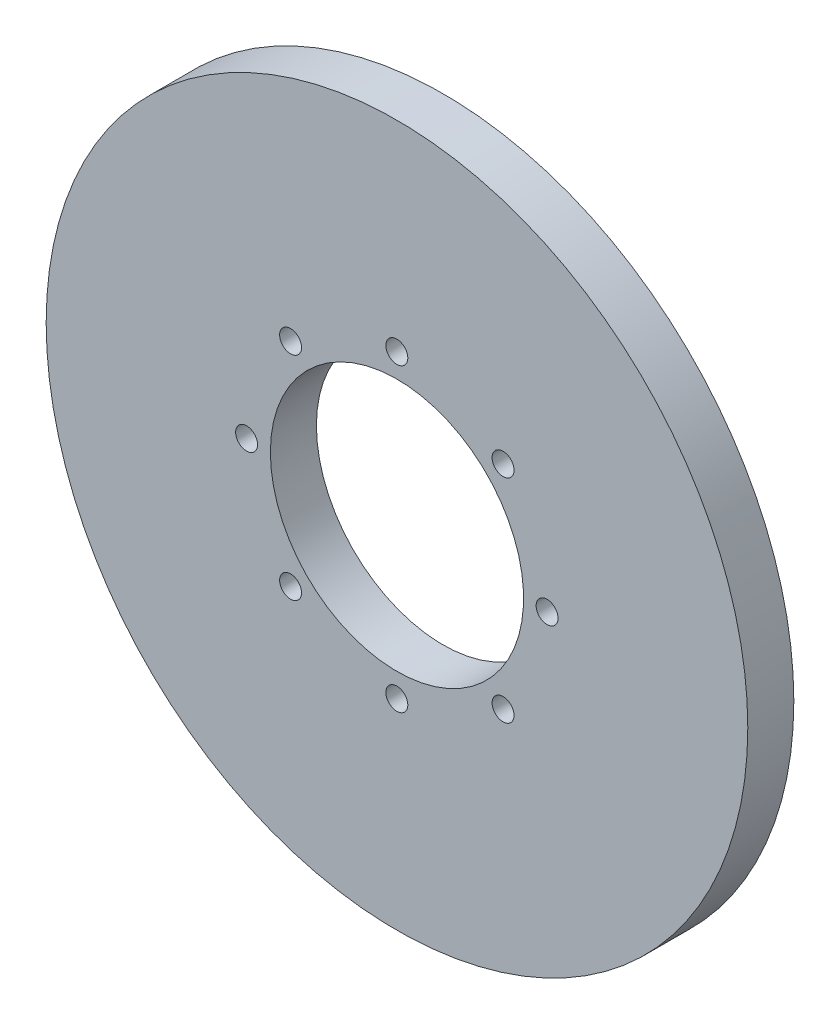
ISO-10303-21;
HEADER;
FILE_DESCRIPTION(('STEP AP214'),'2;1');
FILE_NAME('part.step','',(''),(''),'','','');
FILE_SCHEMA(('AUTOMOTIVE_DESIGN { 1 0 10303 214 1 1 1 1 }'));
ENDSEC;
DATA;
#1=APPLICATION_CONTEXT('core data for automotive mechanical design processes');
#2=APPLICATION_PROTOCOL_DEFINITION('international standard','automotive_design',2000,#1);
#3=PRODUCT_CONTEXT('',#1,'mechanical');
#4=PRODUCT('Part','Part','',(#3));
#5=PRODUCT_RELATED_PRODUCT_CATEGORY('part','',(#4));
#6=PRODUCT_DEFINITION_FORMATION('','',#4);
#7=PRODUCT_DEFINITION_CONTEXT('part definition',#1,'design');
#8=PRODUCT_DEFINITION('design','',#6,#7);
#9=PRODUCT_DEFINITION_SHAPE('','',#8);
#10=(LENGTH_UNIT() NAMED_UNIT(*) SI_UNIT(.MILLI.,.METRE.));
#11=(NAMED_UNIT(*) PLANE_ANGLE_UNIT() SI_UNIT($,.RADIAN.));
#12=(NAMED_UNIT(*) SI_UNIT($,.STERADIAN.) SOLID_ANGLE_UNIT());
#13=UNCERTAINTY_MEASURE_WITH_UNIT(LENGTH_MEASURE(1.E-05),#10,'distance_accuracy_value','');
#14=(GEOMETRIC_REPRESENTATION_CONTEXT(3) GLOBAL_UNCERTAINTY_ASSIGNED_CONTEXT((#13)) GLOBAL_UNIT_ASSIGNED_CONTEXT((#10,
#11,#12)) REPRESENTATION_CONTEXT('',''));
#15=CARTESIAN_POINT('',(0.,0.,0.));
#16=DIRECTION('',(0.,0.,1.));
#17=DIRECTION('',(1.,0.,0.));
#18=AXIS2_PLACEMENT_3D('',#15,#16,#17);
#19=CARTESIAN_POINT('',(0.,0.,20.));
#20=DIRECTION('',(0.,0.,-1.));
#21=DIRECTION('',(-1.,0.,0.));
#22=AXIS2_PLACEMENT_3D('',#19,#20,#21);
#23=CYLINDRICAL_SURFACE('',#22,152.4);
#24=CARTESIAN_POINT('',(0.,0.,20.));
#25=DIRECTION('',(0.,0.,1.));
#26=DIRECTION('',(1.,0.,0.));
#27=AXIS2_PLACEMENT_3D('',#24,#25,#26);
#28=CIRCLE('',#27,152.4);
#29=CARTESIAN_POINT('',(152.4,0.,20.));
#30=VERTEX_POINT('',#29);
#31=EDGE_CURVE('E10',#30,#30,#28,.T.);
#32=ORIENTED_EDGE('',*,*,#31,.F.);
#33=EDGE_LOOP('',(#32));
#34=FACE_BOUND('',#33,.T.);
#35=CARTESIAN_POINT('',(0.,0.,0.));
#36=DIRECTION('',(0.,0.,1.));
#37=DIRECTION('',(1.,0.,0.));
#38=AXIS2_PLACEMENT_3D('',#35,#36,#37);
#39=CIRCLE('',#38,152.4);
#40=CARTESIAN_POINT('',(152.4,0.,0.));
#41=VERTEX_POINT('',#40);
#42=EDGE_CURVE('E39',#41,#41,#39,.T.);
#43=ORIENTED_EDGE('',*,*,#42,.T.);
#44=EDGE_LOOP('',(#43));
#45=FACE_BOUND('',#44,.T.);
#46=ADVANCED_FACE('F36',(#34,#45),#23,.T.);
#47=CARTESIAN_POINT('',(0.,0.,20.));
#48=DIRECTION('',(0.,0.,1.));
#49=DIRECTION('',(1.,0.,0.));
#50=AXIS2_PLACEMENT_3D('',#47,#48,#49);
#51=PLANE('',#50);
#52=CARTESIAN_POINT('',(0.,0.,20.));
#53=DIRECTION('',(0.,0.,-1.));
#54=DIRECTION('',(-1.,0.,0.));
#55=AXIS2_PLACEMENT_3D('',#52,#53,#54);
#56=CIRCLE('',#55,55.);
#57=CARTESIAN_POINT('',(-55.,0.,20.));
#58=VERTEX_POINT('',#57);
#59=EDGE_CURVE('E95',#58,#58,#56,.T.);
#60=ORIENTED_EDGE('',*,*,#59,.T.);
#61=EDGE_LOOP('',(#60));
#62=FACE_BOUND('',#61,.T.);
#63=CARTESIAN_POINT('',(46.0846948431713,46.1484289585171,20.));
#64=DIRECTION('',(0.,0.,-1.));
#65=DIRECTION('',(-1.,0.,0.));
#66=AXIS2_PLACEMENT_3D('',#63,#64,#65);
#67=CIRCLE('',#66,4.7625);
#68=CARTESIAN_POINT('',(41.3221948431713,46.1484289585171,20.));
#69=VERTEX_POINT('',#68);
#70=EDGE_CURVE('E89',#69,#69,#67,.T.);
#71=ORIENTED_EDGE('',*,*,#70,.T.);
#72=EDGE_LOOP('',(#71));
#73=FACE_BOUND('',#72,.T.);
#74=CARTESIAN_POINT('',(-0.0637341153463107,65.263734115347,20.));
#75=DIRECTION('',(0.,0.,-1.));
#76=DIRECTION('',(-1.,0.,0.));
#77=AXIS2_PLACEMENT_3D('',#74,#75,#76);
#78=CIRCLE('',#77,4.76249999999999);
#79=CARTESIAN_POINT('',(-4.82623411534631,65.263734115347,20.));
#80=VERTEX_POINT('',#79);
#81=EDGE_CURVE('E83',#80,#80,#78,.T.);
#82=ORIENTED_EDGE('',*,*,#81,.T.);
#83=EDGE_LOOP('',(#82));
#84=FACE_BOUND('',#83,.T.);
#85=CARTESIAN_POINT('',(-46.2121630738643,46.1484289585181,20.));
#86=DIRECTION('',(0.,0.,-1.));
#87=DIRECTION('',(-1.,0.,0.));
#88=AXIS2_PLACEMENT_3D('',#85,#86,#87);
#89=CIRCLE('',#88,4.7625);
#90=CARTESIAN_POINT('',(-50.9746630738643,46.1484289585181,20.));
#91=VERTEX_POINT('',#90);
#92=EDGE_CURVE('E77',#91,#91,#89,.T.);
#93=ORIENTED_EDGE('',*,*,#92,.T.);
#94=EDGE_LOOP('',(#93));
#95=FACE_BOUND('',#94,.T.);
#96=CARTESIAN_POINT('',(-65.327468230694,0.,20.));
#97=DIRECTION('',(0.,0.,-1.));
#98=DIRECTION('',(-1.,0.,0.));
#99=AXIS2_PLACEMENT_3D('',#96,#97,#98);
#100=CIRCLE('',#99,4.7625);
#101=CARTESIAN_POINT('',(-70.089968230694,0.,20.));
#102=VERTEX_POINT('',#101);
#103=EDGE_CURVE('E71',#102,#102,#100,.T.);
#104=ORIENTED_EDGE('',*,*,#103,.T.);
#105=EDGE_LOOP('',(#104));
#106=FACE_BOUND('',#105,.T.);
#107=CARTESIAN_POINT('',(-46.2121630738649,-46.1484289585174,20.));
#108=DIRECTION('',(0.,0.,-1.));
#109=DIRECTION('',(-1.,0.,0.));
#110=AXIS2_PLACEMENT_3D('',#107,#108,#109);
#111=CIRCLE('',#110,4.7625);
#112=CARTESIAN_POINT('',(-50.9746630738649,-46.1484289585174,20.));
#113=VERTEX_POINT('',#112);
#114=EDGE_CURVE('E65',#113,#113,#111,.T.);
#115=ORIENTED_EDGE('',*,*,#114,.T.);
#116=EDGE_LOOP('',(#115));
#117=FACE_BOUND('',#116,.T.);
#118=CARTESIAN_POINT('',(-0.0637341153472222,-65.263734115347,20.));
#119=DIRECTION('',(0.,0.,-1.));
#120=DIRECTION('',(-1.,0.,0.));
#121=AXIS2_PLACEMENT_3D('',#118,#119,#120);
#122=CIRCLE('',#121,4.76249999999999);
#123=CARTESIAN_POINT('',(-4.82623411534722,-65.263734115347,20.));
#124=VERTEX_POINT('',#123);
#125=EDGE_CURVE('E59',#124,#124,#122,.T.);
#126=ORIENTED_EDGE('',*,*,#125,.T.);
#127=EDGE_LOOP('',(#126));
#128=FACE_BOUND('',#127,.T.);
#129=CARTESIAN_POINT('',(46.0846948431706,-46.1484289585178,20.));
#130=DIRECTION('',(0.,0.,-1.));
#131=DIRECTION('',(-1.,0.,0.));
#132=AXIS2_PLACEMENT_3D('',#129,#130,#131);
#133=CIRCLE('',#132,4.7625);
#134=CARTESIAN_POINT('',(41.3221948431706,-46.1484289585178,20.));
#135=VERTEX_POINT('',#134);
#136=EDGE_CURVE('E53',#135,#135,#133,.T.);
#137=ORIENTED_EDGE('',*,*,#136,.T.);
#138=EDGE_LOOP('',(#137));
#139=FACE_BOUND('',#138,.T.);
#140=CARTESIAN_POINT('',(65.2,0.,20.));
#141=DIRECTION('',(0.,0.,-1.));
#142=DIRECTION('',(-1.,0.,0.));
#143=AXIS2_PLACEMENT_3D('',#140,#141,#142);
#144=CIRCLE('',#143,4.76249999999999);
#145=CARTESIAN_POINT('',(60.4375,0.,20.));
#146=VERTEX_POINT('',#145);
#147=EDGE_CURVE('E46',#146,#146,#144,.T.);
#148=ORIENTED_EDGE('',*,*,#147,.T.);
#149=EDGE_LOOP('',(#148));
#150=FACE_BOUND('',#149,.T.);
#151=ORIENTED_EDGE('',*,*,#31,.T.);
#152=EDGE_LOOP('',(#151));
#153=FACE_BOUND('',#152,.T.);
#154=ADVANCED_FACE('F102',(#62,#73,#84,#95,#106,#117,#128,#139,#150,#153),#51,.T.);
#155=CARTESIAN_POINT('',(0.,0.,0.));
#156=DIRECTION('',(0.,0.,1.));
#157=DIRECTION('',(1.,0.,0.));
#158=AXIS2_PLACEMENT_3D('',#155,#156,#157);
#159=PLANE('',#158);
#160=CARTESIAN_POINT('',(0.,0.,0.));
#161=DIRECTION('',(0.,0.,-1.));
#162=DIRECTION('',(-1.,0.,0.));
#163=AXIS2_PLACEMENT_3D('',#160,#161,#162);
#164=CIRCLE('',#163,55.);
#165=CARTESIAN_POINT('',(-55.,0.,0.));
#166=VERTEX_POINT('',#165);
#167=EDGE_CURVE('E96',#166,#166,#164,.T.);
#168=ORIENTED_EDGE('',*,*,#167,.F.);
#169=EDGE_LOOP('',(#168));
#170=FACE_BOUND('',#169,.T.);
#171=CARTESIAN_POINT('',(46.0846948431713,46.1484289585171,0.));
#172=DIRECTION('',(0.,0.,-1.));
#173=DIRECTION('',(-1.,0.,0.));
#174=AXIS2_PLACEMENT_3D('',#171,#172,#173);
#175=CIRCLE('',#174,4.76249999999999);
#176=CARTESIAN_POINT('',(41.3221948431713,46.1484289585171,0.));
#177=VERTEX_POINT('',#176);
#178=EDGE_CURVE('E92',#177,#177,#175,.T.);
#179=ORIENTED_EDGE('',*,*,#178,.F.);
#180=EDGE_LOOP('',(#179));
#181=FACE_BOUND('',#180,.T.);
#182=CARTESIAN_POINT('',(-0.0637341153463107,65.263734115347,0.));
#183=DIRECTION('',(0.,0.,-1.));
#184=DIRECTION('',(-1.,0.,0.));
#185=AXIS2_PLACEMENT_3D('',#182,#183,#184);
#186=CIRCLE('',#185,4.76249999999999);
#187=CARTESIAN_POINT('',(-4.8262341153463,65.263734115347,0.));
#188=VERTEX_POINT('',#187);
#189=EDGE_CURVE('E86',#188,#188,#186,.T.);
#190=ORIENTED_EDGE('',*,*,#189,.F.);
#191=EDGE_LOOP('',(#190));
#192=FACE_BOUND('',#191,.T.);
#193=CARTESIAN_POINT('',(-46.2121630738643,46.1484289585181,0.));
#194=DIRECTION('',(0.,0.,-1.));
#195=DIRECTION('',(-1.,0.,0.));
#196=AXIS2_PLACEMENT_3D('',#193,#194,#195);
#197=CIRCLE('',#196,4.76249999999999);
#198=CARTESIAN_POINT('',(-50.9746630738643,46.1484289585181,0.));
#199=VERTEX_POINT('',#198);
#200=EDGE_CURVE('E80',#199,#199,#197,.T.);
#201=ORIENTED_EDGE('',*,*,#200,.F.);
#202=EDGE_LOOP('',(#201));
#203=FACE_BOUND('',#202,.T.);
#204=CARTESIAN_POINT('',(-65.327468230694,0.,0.));
#205=DIRECTION('',(0.,0.,-1.));
#206=DIRECTION('',(-1.,0.,0.));
#207=AXIS2_PLACEMENT_3D('',#204,#205,#206);
#208=CIRCLE('',#207,4.76249999999999);
#209=CARTESIAN_POINT('',(-70.089968230694,0.,0.));
#210=VERTEX_POINT('',#209);
#211=EDGE_CURVE('E74',#210,#210,#208,.T.);
#212=ORIENTED_EDGE('',*,*,#211,.F.);
#213=EDGE_LOOP('',(#212));
#214=FACE_BOUND('',#213,.T.);
#215=CARTESIAN_POINT('',(-46.2121630738649,-46.1484289585174,0.));
#216=DIRECTION('',(0.,0.,-1.));
#217=DIRECTION('',(-1.,0.,0.));
#218=AXIS2_PLACEMENT_3D('',#215,#216,#217);
#219=CIRCLE('',#218,4.76249999999999);
#220=CARTESIAN_POINT('',(-50.9746630738649,-46.1484289585174,0.));
#221=VERTEX_POINT('',#220);
#222=EDGE_CURVE('E68',#221,#221,#219,.T.);
#223=ORIENTED_EDGE('',*,*,#222,.F.);
#224=EDGE_LOOP('',(#223));
#225=FACE_BOUND('',#224,.T.);
#226=CARTESIAN_POINT('',(-0.0637341153472222,-65.263734115347,0.));
#227=DIRECTION('',(0.,0.,-1.));
#228=DIRECTION('',(-1.,0.,0.));
#229=AXIS2_PLACEMENT_3D('',#226,#227,#228);
#230=CIRCLE('',#229,4.76249999999999);
#231=CARTESIAN_POINT('',(-4.82623411534721,-65.263734115347,0.));
#232=VERTEX_POINT('',#231);
#233=EDGE_CURVE('E62',#232,#232,#230,.T.);
#234=ORIENTED_EDGE('',*,*,#233,.F.);
#235=EDGE_LOOP('',(#234));
#236=FACE_BOUND('',#235,.T.);
#237=CARTESIAN_POINT('',(46.0846948431706,-46.1484289585178,0.));
#238=DIRECTION('',(0.,0.,-1.));
#239=DIRECTION('',(-1.,0.,0.));
#240=AXIS2_PLACEMENT_3D('',#237,#238,#239);
#241=CIRCLE('',#240,4.76249999999999);
#242=CARTESIAN_POINT('',(41.3221948431706,-46.1484289585178,0.));
#243=VERTEX_POINT('',#242);
#244=EDGE_CURVE('E56',#243,#243,#241,.T.);
#245=ORIENTED_EDGE('',*,*,#244,.F.);
#246=EDGE_LOOP('',(#245));
#247=FACE_BOUND('',#246,.T.);
#248=CARTESIAN_POINT('',(65.2,0.,0.));
#249=DIRECTION('',(0.,0.,-1.));
#250=DIRECTION('',(-1.,0.,0.));
#251=AXIS2_PLACEMENT_3D('',#248,#249,#250);
#252=CIRCLE('',#251,4.76249999999999);
#253=CARTESIAN_POINT('',(60.4375,0.,0.));
#254=VERTEX_POINT('',#253);
#255=EDGE_CURVE('E50',#254,#254,#252,.T.);
#256=ORIENTED_EDGE('',*,*,#255,.F.);
#257=EDGE_LOOP('',(#256));
#258=FACE_BOUND('',#257,.T.);
#259=ORIENTED_EDGE('',*,*,#42,.F.);
#260=EDGE_LOOP('',(#259));
#261=FACE_BOUND('',#260,.T.);
#262=ADVANCED_FACE('F112',(#170,#181,#192,#203,#214,#225,#236,#247,#258,#261),#159,.F.);
#263=CARTESIAN_POINT('',(65.2,0.,0.));
#264=DIRECTION('',(0.,0.,-1.));
#265=DIRECTION('',(-1.,0.,0.));
#266=AXIS2_PLACEMENT_3D('',#263,#264,#265);
#267=CYLINDRICAL_SURFACE('',#266,4.76249999999999);
#268=ORIENTED_EDGE('',*,*,#147,.F.);
#269=EDGE_LOOP('',(#268));
#270=FACE_BOUND('',#269,.T.);
#271=ORIENTED_EDGE('',*,*,#255,.T.);
#272=EDGE_LOOP('',(#271));
#273=FACE_BOUND('',#272,.T.);
#274=ADVANCED_FACE('F115',(#270,#273),#267,.F.);
#275=CARTESIAN_POINT('',(46.0846948431706,-46.1484289585178,0.));
#276=DIRECTION('',(0.,0.,-1.));
#277=DIRECTION('',(-1.,0.,0.));
#278=AXIS2_PLACEMENT_3D('',#275,#276,#277);
#279=CYLINDRICAL_SURFACE('',#278,4.76249999999999);
#280=ORIENTED_EDGE('',*,*,#136,.F.);
#281=EDGE_LOOP('',(#280));
#282=FACE_BOUND('',#281,.T.);
#283=ORIENTED_EDGE('',*,*,#244,.T.);
#284=EDGE_LOOP('',(#283));
#285=FACE_BOUND('',#284,.T.);
#286=ADVANCED_FACE('F145',(#282,#285),#279,.F.);
#287=CARTESIAN_POINT('',(-0.0637341153472222,-65.263734115347,0.));
#288=DIRECTION('',(0.,0.,-1.));
#289=DIRECTION('',(-1.,0.,0.));
#290=AXIS2_PLACEMENT_3D('',#287,#288,#289);
#291=CYLINDRICAL_SURFACE('',#290,4.76249999999999);
#292=ORIENTED_EDGE('',*,*,#125,.F.);
#293=EDGE_LOOP('',(#292));
#294=FACE_BOUND('',#293,.T.);
#295=ORIENTED_EDGE('',*,*,#233,.T.);
#296=EDGE_LOOP('',(#295));
#297=FACE_BOUND('',#296,.T.);
#298=ADVANCED_FACE('F149',(#294,#297),#291,.F.);
#299=CARTESIAN_POINT('',(-46.2121630738649,-46.1484289585174,0.));
#300=DIRECTION('',(0.,0.,-1.));
#301=DIRECTION('',(-1.,0.,0.));
#302=AXIS2_PLACEMENT_3D('',#299,#300,#301);
#303=CYLINDRICAL_SURFACE('',#302,4.76249999999999);
#304=ORIENTED_EDGE('',*,*,#114,.F.);
#305=EDGE_LOOP('',(#304));
#306=FACE_BOUND('',#305,.T.);
#307=ORIENTED_EDGE('',*,*,#222,.T.);
#308=EDGE_LOOP('',(#307));
#309=FACE_BOUND('',#308,.T.);
#310=ADVANCED_FACE('F153',(#306,#309),#303,.F.);
#311=CARTESIAN_POINT('',(-65.327468230694,0.,0.));
#312=DIRECTION('',(0.,0.,-1.));
#313=DIRECTION('',(-1.,0.,0.));
#314=AXIS2_PLACEMENT_3D('',#311,#312,#313);
#315=CYLINDRICAL_SURFACE('',#314,4.76249999999999);
#316=ORIENTED_EDGE('',*,*,#103,.F.);
#317=EDGE_LOOP('',(#316));
#318=FACE_BOUND('',#317,.T.);
#319=ORIENTED_EDGE('',*,*,#211,.T.);
#320=EDGE_LOOP('',(#319));
#321=FACE_BOUND('',#320,.T.);
#322=ADVANCED_FACE('F157',(#318,#321),#315,.F.);
#323=CARTESIAN_POINT('',(-46.2121630738643,46.1484289585181,0.));
#324=DIRECTION('',(0.,0.,-1.));
#325=DIRECTION('',(-1.,0.,0.));
#326=AXIS2_PLACEMENT_3D('',#323,#324,#325);
#327=CYLINDRICAL_SURFACE('',#326,4.76249999999999);
#328=ORIENTED_EDGE('',*,*,#92,.F.);
#329=EDGE_LOOP('',(#328));
#330=FACE_BOUND('',#329,.T.);
#331=ORIENTED_EDGE('',*,*,#200,.T.);
#332=EDGE_LOOP('',(#331));
#333=FACE_BOUND('',#332,.T.);
#334=ADVANCED_FACE('F161',(#330,#333),#327,.F.);
#335=CARTESIAN_POINT('',(-0.0637341153463107,65.263734115347,0.));
#336=DIRECTION('',(0.,0.,-1.));
#337=DIRECTION('',(-1.,0.,0.));
#338=AXIS2_PLACEMENT_3D('',#335,#336,#337);
#339=CYLINDRICAL_SURFACE('',#338,4.76249999999999);
#340=ORIENTED_EDGE('',*,*,#81,.F.);
#341=EDGE_LOOP('',(#340));
#342=FACE_BOUND('',#341,.T.);
#343=ORIENTED_EDGE('',*,*,#189,.T.);
#344=EDGE_LOOP('',(#343));
#345=FACE_BOUND('',#344,.T.);
#346=ADVANCED_FACE('F165',(#342,#345),#339,.F.);
#347=CARTESIAN_POINT('',(46.0846948431713,46.1484289585171,0.));
#348=DIRECTION('',(0.,0.,-1.));
#349=DIRECTION('',(-1.,0.,0.));
#350=AXIS2_PLACEMENT_3D('',#347,#348,#349);
#351=CYLINDRICAL_SURFACE('',#350,4.76249999999999);
#352=ORIENTED_EDGE('',*,*,#70,.F.);
#353=EDGE_LOOP('',(#352));
#354=FACE_BOUND('',#353,.T.);
#355=ORIENTED_EDGE('',*,*,#178,.T.);
#356=EDGE_LOOP('',(#355));
#357=FACE_BOUND('',#356,.T.);
#358=ADVANCED_FACE('F108',(#354,#357),#351,.F.);
#359=CARTESIAN_POINT('',(0.,0.,20.));
#360=DIRECTION('',(0.,0.,-1.));
#361=DIRECTION('',(-1.,0.,0.));
#362=AXIS2_PLACEMENT_3D('',#359,#360,#361);
#363=CYLINDRICAL_SURFACE('',#362,55.);
#364=ORIENTED_EDGE('',*,*,#59,.F.);
#365=EDGE_LOOP('',(#364));
#366=FACE_BOUND('',#365,.T.);
#367=ORIENTED_EDGE('',*,*,#167,.T.);
#368=EDGE_LOOP('',(#367));
#369=FACE_BOUND('',#368,.T.);
#370=ADVANCED_FACE('F105',(#366,#369),#363,.F.);
#371=CLOSED_SHELL('',(#46,#154,#262,#274,#286,#298,#310,#322,#334,#346,#358,#370));
#372=MANIFOLD_SOLID_BREP('B2',#371);
#373=ADVANCED_BREP_SHAPE_REPRESENTATION('',(#18,#372),#14);
#374=SHAPE_DEFINITION_REPRESENTATION(#9,#373);
ENDSEC;
END-ISO-10303-21;
